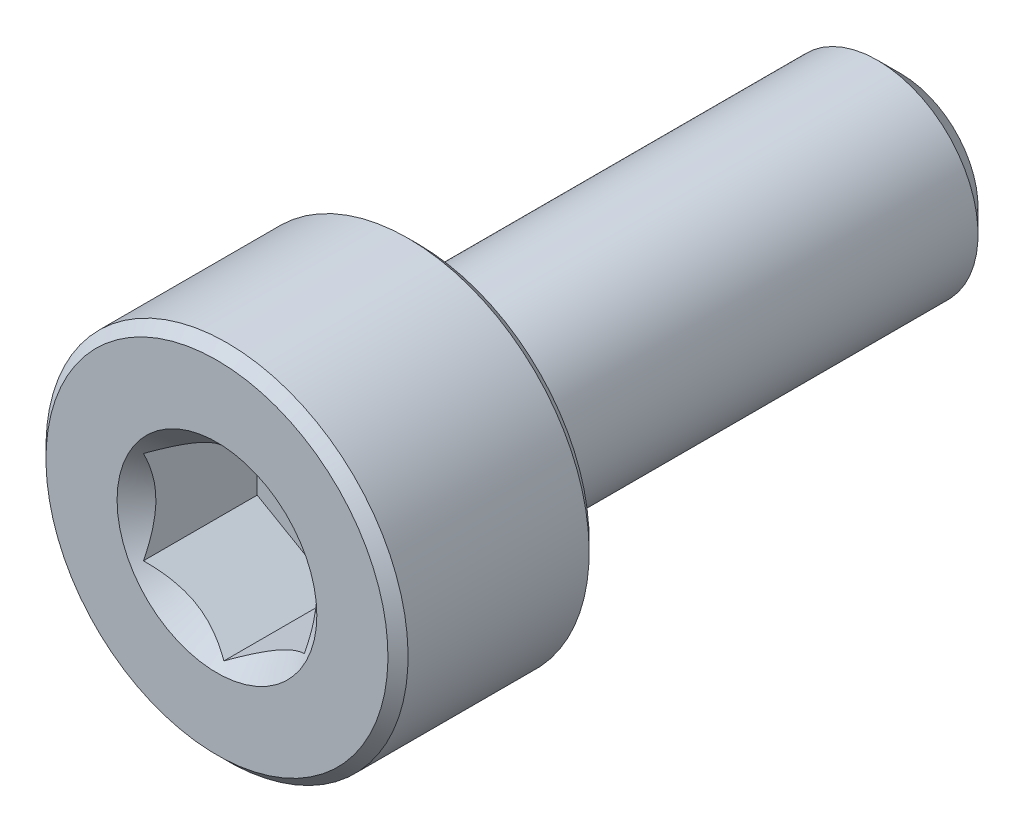
ISO-10303-21;
HEADER;
FILE_DESCRIPTION(('STEP AP214'),'2;1');
FILE_NAME('part.step','',(''),(''),'','','');
FILE_SCHEMA(('AUTOMOTIVE_DESIGN { 1 0 10303 214 1 1 1 1 }'));
ENDSEC;
DATA;
#1=APPLICATION_CONTEXT('core data for automotive mechanical design processes');
#2=APPLICATION_PROTOCOL_DEFINITION('international standard','automotive_design',2000,#1);
#3=PRODUCT_CONTEXT('',#1,'mechanical');
#4=PRODUCT('Part','Part','',(#3));
#5=PRODUCT_RELATED_PRODUCT_CATEGORY('part','',(#4));
#6=PRODUCT_DEFINITION_FORMATION('','',#4);
#7=PRODUCT_DEFINITION_CONTEXT('part definition',#1,'design');
#8=PRODUCT_DEFINITION('design','',#6,#7);
#9=PRODUCT_DEFINITION_SHAPE('','',#8);
#10=(LENGTH_UNIT() NAMED_UNIT(*) SI_UNIT(.MILLI.,.METRE.));
#11=(NAMED_UNIT(*) PLANE_ANGLE_UNIT() SI_UNIT($,.RADIAN.));
#12=(NAMED_UNIT(*) SI_UNIT($,.STERADIAN.) SOLID_ANGLE_UNIT());
#13=UNCERTAINTY_MEASURE_WITH_UNIT(LENGTH_MEASURE(1.E-05),#10,'distance_accuracy_value','');
#14=(GEOMETRIC_REPRESENTATION_CONTEXT(3) GLOBAL_UNCERTAINTY_ASSIGNED_CONTEXT((#13)) GLOBAL_UNIT_ASSIGNED_CONTEXT((#10,
#11,#12)) REPRESENTATION_CONTEXT('',''));
#15=CARTESIAN_POINT('',(0.,0.,0.));
#16=DIRECTION('',(0.,0.,1.));
#17=DIRECTION('',(1.,0.,0.));
#18=AXIS2_PLACEMENT_3D('',#15,#16,#17);
#19=CARTESIAN_POINT('',(0.,0.,1.625));
#20=DIRECTION('',(0.,0.,-1.));
#21=DIRECTION('',(0.,1.,0.));
#22=AXIS2_PLACEMENT_3D('',#19,#20,#21);
#23=TOROIDAL_SURFACE('',#22,1.375,0.125);
#24=CARTESIAN_POINT('',(0.,0.,1.75));
#25=DIRECTION('',(0.,0.,-1.));
#26=DIRECTION('',(0.,1.,0.));
#27=AXIS2_PLACEMENT_3D('',#24,#25,#26);
#28=CIRCLE('',#27,1.375);
#29=CARTESIAN_POINT('',(0.,1.375,1.75));
#30=VERTEX_POINT('',#29);
#31=EDGE_CURVE('E247',#30,#30,#28,.T.);
#32=ORIENTED_EDGE('',*,*,#31,.T.);
#33=EDGE_LOOP('',(#32));
#34=FACE_BOUND('',#33,.T.);
#35=CARTESIAN_POINT('',(0.,0.,1.625));
#36=DIRECTION('',(0.,0.,-1.));
#37=DIRECTION('',(0.,1.,0.));
#38=AXIS2_PLACEMENT_3D('',#35,#36,#37);
#39=CIRCLE('',#38,1.25);
#40=CARTESIAN_POINT('',(0.,1.25,1.625));
#41=VERTEX_POINT('',#40);
#42=EDGE_CURVE('E55',#41,#41,#39,.T.);
#43=ORIENTED_EDGE('',*,*,#42,.F.);
#44=EDGE_LOOP('',(#43));
#45=FACE_BOUND('',#44,.T.);
#46=ADVANCED_FACE('F50',(#34,#45),#23,.F.);
#47=CARTESIAN_POINT('',(0.,2.125,1.75));
#48=DIRECTION('',(0.,0.,-1.));
#49=DIRECTION('',(0.,1.,0.));
#50=AXIS2_PLACEMENT_3D('',#47,#48,#49);
#51=PLANE('',#50);
#52=CARTESIAN_POINT('',(0.,0.,1.75));
#53=DIRECTION('',(0.,0.,-1.));
#54=DIRECTION('',(0.,1.,0.));
#55=AXIS2_PLACEMENT_3D('',#52,#53,#54);
#56=CIRCLE('',#55,2.125);
#57=CARTESIAN_POINT('',(0.,2.125,1.75));
#58=VERTEX_POINT('',#57);
#59=EDGE_CURVE('E249',#58,#58,#56,.T.);
#60=ORIENTED_EDGE('',*,*,#59,.T.);
#61=EDGE_LOOP('',(#60));
#62=FACE_BOUND('',#61,.T.);
#63=ORIENTED_EDGE('',*,*,#31,.F.);
#64=EDGE_LOOP('',(#63));
#65=FACE_BOUND('',#64,.T.);
#66=ADVANCED_FACE('F117',(#62,#65),#51,.T.);
#67=CARTESIAN_POINT('',(0.,0.,1.75));
#68=DIRECTION('',(0.,0.,1.));
#69=DIRECTION('',(0.,-1.,0.));
#70=AXIS2_PLACEMENT_3D('',#67,#68,#69);
#71=CONICAL_SURFACE('',#70,2.125,0.78539816339745);
#72=CARTESIAN_POINT('',(0.,0.,1.875));
#73=DIRECTION('',(0.,0.,-1.));
#74=DIRECTION('',(0.,1.,0.));
#75=AXIS2_PLACEMENT_3D('',#72,#73,#74);
#76=CIRCLE('',#75,2.25);
#77=CARTESIAN_POINT('',(0.,2.25,1.875));
#78=VERTEX_POINT('',#77);
#79=EDGE_CURVE('E258',#78,#78,#76,.T.);
#80=ORIENTED_EDGE('',*,*,#79,.T.);
#81=EDGE_LOOP('',(#80));
#82=FACE_BOUND('',#81,.T.);
#83=ORIENTED_EDGE('',*,*,#59,.F.);
#84=EDGE_LOOP('',(#83));
#85=FACE_BOUND('',#84,.T.);
#86=ADVANCED_FACE('F122',(#82,#85),#71,.T.);
#87=CARTESIAN_POINT('',(0.,0.,-4.25));
#88=DIRECTION('',(0.,0.,-1.));
#89=DIRECTION('',(0.,1.,0.));
#90=AXIS2_PLACEMENT_3D('',#87,#88,#89);
#91=CYLINDRICAL_SURFACE('',#90,2.25);
#92=CARTESIAN_POINT('',(0.,0.,4.125));
#93=DIRECTION('',(0.,0.,-1.));
#94=DIRECTION('',(0.,1.,0.));
#95=AXIS2_PLACEMENT_3D('',#92,#93,#94);
#96=CIRCLE('',#95,2.25);
#97=CARTESIAN_POINT('',(0.,2.25,4.125));
#98=VERTEX_POINT('',#97);
#99=EDGE_CURVE('E237',#98,#98,#96,.T.);
#100=ORIENTED_EDGE('',*,*,#99,.T.);
#101=EDGE_LOOP('',(#100));
#102=FACE_BOUND('',#101,.T.);
#103=ORIENTED_EDGE('',*,*,#79,.F.);
#104=EDGE_LOOP('',(#103));
#105=FACE_BOUND('',#104,.T.);
#106=ADVANCED_FACE('F130',(#102,#105),#91,.T.);
#107=CARTESIAN_POINT('',(0.,0.,4.125));
#108=DIRECTION('',(0.,0.,-1.));
#109=DIRECTION('',(0.,1.,0.));
#110=AXIS2_PLACEMENT_3D('',#107,#108,#109);
#111=CONICAL_SURFACE('',#110,2.25,0.78539816339745);
#112=CARTESIAN_POINT('',(0.,0.,4.25));
#113=DIRECTION('',(0.,0.,-1.));
#114=DIRECTION('',(0.,1.,0.));
#115=AXIS2_PLACEMENT_3D('',#112,#113,#114);
#116=CIRCLE('',#115,2.125);
#117=CARTESIAN_POINT('',(0.,2.125,4.25));
#118=VERTEX_POINT('',#117);
#119=EDGE_CURVE('E234',#118,#118,#116,.T.);
#120=ORIENTED_EDGE('',*,*,#119,.T.);
#121=EDGE_LOOP('',(#120));
#122=FACE_BOUND('',#121,.T.);
#123=ORIENTED_EDGE('',*,*,#99,.F.);
#124=EDGE_LOOP('',(#123));
#125=FACE_BOUND('',#124,.T.);
#126=ADVANCED_FACE('F134',(#122,#125),#111,.T.);
#127=CARTESIAN_POINT('',(0.,0.,4.25));
#128=DIRECTION('',(0.,0.,1.));
#129=DIRECTION('',(0.,-1.,0.));
#130=AXIS2_PLACEMENT_3D('',#127,#128,#129);
#131=PLANE('',#130);
#132=CARTESIAN_POINT('',(0.,0.,4.25));
#133=DIRECTION('',(0.,0.,1.));
#134=DIRECTION('',(1.,0.,0.));
#135=AXIS2_PLACEMENT_3D('',#132,#133,#134);
#136=CIRCLE('',#135,1.2413030787577);
#137=CARTESIAN_POINT('',(1.2413030787577,0.,4.25));
#138=VERTEX_POINT('',#137);
#139=EDGE_CURVE('E12',#138,#138,#136,.T.);
#140=ORIENTED_EDGE('',*,*,#139,.F.);
#141=EDGE_LOOP('',(#140));
#142=FACE_BOUND('',#141,.T.);
#143=ORIENTED_EDGE('',*,*,#119,.F.);
#144=EDGE_LOOP('',(#143));
#145=FACE_BOUND('',#144,.T.);
#146=ADVANCED_FACE('F138',(#142,#145),#131,.T.);
#147=CARTESIAN_POINT('',(0.,0.,4.25));
#148=DIRECTION('',(0.,0.,1.));
#149=DIRECTION('',(1.,0.,0.));
#150=AXIS2_PLACEMENT_3D('',#147,#148,#149);
#151=CONICAL_SURFACE('',#150,1.2413030787577,0.78539816339745);
#152=ORIENTED_EDGE('',*,*,#139,.T.);
#153=EDGE_LOOP('',(#152));
#154=FACE_BOUND('',#153,.T.);
#155=CARTESIAN_POINT('',(-0.000199999999999783,-1.15481600843309,4.16351294699417));
#156=CARTESIAN_POINT('',(0.0341825950071805,-1.13496520795026,4.14367539044729));
#157=CARTESIAN_POINT('',(0.0691401181398245,-1.11478247255942,4.12500248026044));
#158=CARTESIAN_POINT('',(0.140422802956089,-1.07362739529219,4.09081220234471));
#159=CARTESIAN_POINT('',(0.176754750528984,-1.0526511355808,4.07531386864501));
#160=CARTESIAN_POINT('',(0.250016613803311,-1.01035337909803,4.04876476676382));
#161=CARTESIAN_POINT('',(0.286927851445414,-0.989042666109241,4.03764723361848));
#162=CARTESIAN_POINT('',(0.361562729310859,-0.945952199282692,4.02051732539774));
#163=CARTESIAN_POINT('',(0.399284088108635,-0.924173762626597,4.01449215708823));
#164=CARTESIAN_POINT('',(0.464292198417933,-0.886641312640015,4.00905801458905));
#165=CARTESIAN_POINT('',(0.491494371528172,-0.870936130672276,4.00825439793829));
#166=CARTESIAN_POINT('',(0.545846040669111,-0.839556179862849,4.00960415903844));
#167=CARTESIAN_POINT('',(0.572995523754875,-0.823881418494924,4.01175818916875));
#168=CARTESIAN_POINT('',(0.65405627732696,-0.777080970599367,4.02251443175003));
#169=CARTESIAN_POINT('',(0.707564140978427,-0.74618819111643,4.03541201603691));
#170=CARTESIAN_POINT('',(0.801476065143431,-0.69196811641965,4.06653819022373));
#171=CARTESIAN_POINT('',(0.842320523671834,-0.668386557293372,4.08313525732339));
#172=CARTESIAN_POINT('',(0.922409637381943,-0.622147085933681,4.12052238430685));
#173=CARTESIAN_POINT('',(0.961659010870438,-0.599486449584575,4.14129880143896));
#174=CARTESIAN_POINT('',(1.0002,-0.577234799135788,4.16351294699417));
#175=B_SPLINE_CURVE_WITH_KNOTS('',3,(#155,#156,#157,#158,#159,#160,#161,#162,#163,#164,#165,
#166,#167,#168,#169,#170,#171,#172,#173,#174),.UNSPECIFIED.,.F.,.F.,(4,2,2,2,2,2,2,2,2,4),(0.,
0.133237676828559,0.26725222983449,0.3991370762693,0.530689603280768,0.624814864263846,
0.718960890149133,0.907306626112097,1.05710100361789,1.20641411519286),.UNSPECIFIED.);
#176=CARTESIAN_POINT('',(0.,-1.15470053837925,4.16339745962156));
#177=VERTEX_POINT('',#176);
#178=CARTESIAN_POINT('',(1.,-0.577350269189626,4.16339745962155));
#179=VERTEX_POINT('',#178);
#180=EDGE_CURVE('E67',#177,#179,#175,.T.);
#181=ORIENTED_EDGE('',*,*,#180,.F.);
#182=CARTESIAN_POINT('',(-1.0002,-0.577234799135788,4.16351294699417));
#183=CARTESIAN_POINT('',(-0.965817404992819,-0.597085599618622,4.14367539044729));
#184=CARTESIAN_POINT('',(-0.930859881860175,-0.617268335009456,4.12500248026044));
#185=CARTESIAN_POINT('',(-0.85957719704391,-0.658423412276686,4.09081220234471));
#186=CARTESIAN_POINT('',(-0.823245249471016,-0.67939967198808,4.07531386864501));
#187=CARTESIAN_POINT('',(-0.749983386196689,-0.721697428470846,4.04876476676382));
#188=CARTESIAN_POINT('',(-0.713072148554585,-0.743008141459637,4.03764723361848));
#189=CARTESIAN_POINT('',(-0.638437270689141,-0.786098608286186,4.02051732539774));
#190=CARTESIAN_POINT('',(-0.600715911891364,-0.807877044942281,4.01449215708823));
#191=CARTESIAN_POINT('',(-0.535707801582066,-0.845409494928863,4.00905801458905));
#192=CARTESIAN_POINT('',(-0.508505628471827,-0.861114676896602,4.00825439793829));
#193=CARTESIAN_POINT('',(-0.454153959330887,-0.892494627706029,4.00960415903844));
#194=CARTESIAN_POINT('',(-0.427004476245124,-0.908169389073954,4.01175818916875));
#195=CARTESIAN_POINT('',(-0.345943722673039,-0.954969836969511,4.02251443175003));
#196=CARTESIAN_POINT('',(-0.292435859021572,-0.985862616452447,4.03541201603691));
#197=CARTESIAN_POINT('',(-0.198523934856568,-1.04008269114923,4.06653819022373));
#198=CARTESIAN_POINT('',(-0.157679476328165,-1.06366425027551,4.08313525732339));
#199=CARTESIAN_POINT('',(-0.0775903626180557,-1.1099037216352,4.12052238430685));
#200=CARTESIAN_POINT('',(-0.0383409891295617,-1.1325643579843,4.14129880143896));
#201=CARTESIAN_POINT('',(0.000200000000000583,-1.15481600843309,4.16351294699417));
#202=B_SPLINE_CURVE_WITH_KNOTS('',3,(#182,#183,#184,#185,#186,#187,#188,#189,#190,#191,#192,
#193,#194,#195,#196,#197,#198,#199,#200,#201),.UNSPECIFIED.,.F.,.F.,(4,2,2,2,2,2,2,2,2,4),(0.,
0.133237676828559,0.267252229834491,0.3991370762693,0.530689603280769,0.624814864263847,
0.718960890149134,0.907306626112098,1.05710100361789,1.20641411519286),.UNSPECIFIED.);
#203=CARTESIAN_POINT('',(-1.,-0.577350269189626,4.16339745962156));
#204=VERTEX_POINT('',#203);
#205=EDGE_CURVE('E60',#204,#177,#202,.T.);
#206=ORIENTED_EDGE('',*,*,#205,.F.);
#207=CARTESIAN_POINT('',(-1.,-1.21199087789934,4.57997725527287));
#208=CARTESIAN_POINT('',(-1.,-1.18273650300522,4.55741554693661));
#209=CARTESIAN_POINT('',(-1.,-1.15332592158341,4.53505703381193));
#210=CARTESIAN_POINT('',(-1.,-1.09412680336146,4.4908320719692));
#211=CARTESIAN_POINT('',(-1.,-1.06433818018076,4.46896573899681));
#212=CARTESIAN_POINT('',(-1.,-0.97387129354152,4.4039212875776));
#213=CARTESIAN_POINT('',(-1.,-0.912535008128867,4.3616436137258));
#214=CARTESIAN_POINT('',(-1.,-0.783508251342875,4.27806824785001));
#215=CARTESIAN_POINT('',(-1.,-0.715662620346606,4.23700761033256));
#216=CARTESIAN_POINT('',(-1.,-0.576509894905891,4.16150147066944));
#217=CARTESIAN_POINT('',(-1.,-0.505215555513883,4.12703362621591));
#218=CARTESIAN_POINT('',(-1.,-0.398764046939012,4.08484878246325));
#219=CARTESIAN_POINT('',(-1.,-0.365313297980423,4.07284938948254));
#220=CARTESIAN_POINT('',(-1.,-0.297551245132093,4.05153030995285));
#221=CARTESIAN_POINT('',(-1.,-0.263239887100777,4.04221079245894));
#222=CARTESIAN_POINT('',(-1.,-0.194571067470056,4.02691167587498));
#223=CARTESIAN_POINT('',(-1.,-0.160227555987668,4.02087048308474));
#224=CARTESIAN_POINT('',(-1.,-0.0910948269867766,4.01225224503756));
#225=CARTESIAN_POINT('',(-1.,-0.0563055613802756,4.009675576765));
#226=CARTESIAN_POINT('',(-1.,0.0117927152654021,4.00821295512037));
#227=CARTESIAN_POINT('',(-1.,0.0450983170825075,4.00916703835344));
#228=CARTESIAN_POINT('',(-1.,0.111441413420384,4.01434362211099));
#229=CARTESIAN_POINT('',(-1.,0.144478971732107,4.01856532046785));
#230=CARTESIAN_POINT('',(-1.,0.210624763290572,4.03010847896862));
#231=CARTESIAN_POINT('',(-1.,0.243723154740698,4.03748543479042));
#232=CARTESIAN_POINT('',(-1.,0.309187738497536,4.05492899920948));
#233=CARTESIAN_POINT('',(-1.,0.341553969590706,4.06499546496534));
#234=CARTESIAN_POINT('',(-1.,0.440875348086756,4.09974257065232));
#235=CARTESIAN_POINT('',(-1.,0.506480526276305,4.1282699754181));
#236=CARTESIAN_POINT('',(-1.,0.634628446237199,4.19175922476326));
#237=CARTESIAN_POINT('',(-1.,0.697159414671816,4.22674368431451));
#238=CARTESIAN_POINT('',(-1.,0.816694357126198,4.29898555821879));
#239=CARTESIAN_POINT('',(-1.,0.873818851530728,4.33604607035742));
#240=CARTESIAN_POINT('',(-1.,0.957979712513755,4.39336695643995));
#241=CARTESIAN_POINT('',(-1.,0.985671461150836,4.41268175945423));
#242=CARTESIAN_POINT('',(-1.,1.04067496120981,4.45182989264588));
#243=CARTESIAN_POINT('',(-1.,1.06798681474316,4.47166307919343));
#244=CARTESIAN_POINT('',(-1.,1.09514019811391,4.49171143685736));
#245=B_SPLINE_CURVE_WITH_KNOTS('',3,(#207,#208,#209,#210,#211,#212,#213,#214,#215,#216,#217,
#218,#219,#220,#221,#222,#223,#224,#225,#226,#227,#228,#229,#230,#231,#232,#233,#234,#235,#236,
#237,#238,#239,#240,#241,#242,#243,#244),.UNSPECIFIED.,.F.,.F.,(4,2,2,2,2,2,2,2,2,2,2,2,2,2,2,2,
2,2,4),(0.,0.110828944200308,0.221683685263867,0.445078388583645,0.682811068621036,
0.919723239940847,1.02624790401867,1.13277928653702,1.23723298361624,1.34169804566787,
1.44148938783186,1.54125623996228,1.64285505347063,1.74444847208079,1.95844200767913,
2.17319976124347,2.3773768581412,2.47865984803709,2.57991506662171),.UNSPECIFIED.);
#246=CARTESIAN_POINT('',(-1.,0.577350269189625,4.16339745962155));
#247=VERTEX_POINT('',#246);
#248=EDGE_CURVE('E176',#247,#204,#245,.F.);
#249=ORIENTED_EDGE('',*,*,#248,.F.);
#250=CARTESIAN_POINT('',(0.000199999999999878,1.15481600843309,4.16351294699417));
#251=CARTESIAN_POINT('',(-0.0341825950071805,1.13496520795026,4.14367539044729));
#252=CARTESIAN_POINT('',(-0.0691401181398246,1.11478247255942,4.12500248026044));
#253=CARTESIAN_POINT('',(-0.140422802956089,1.07362739529219,4.09081220234471));
#254=CARTESIAN_POINT('',(-0.176754750528984,1.0526511355808,4.07531386864501));
#255=CARTESIAN_POINT('',(-0.250016613803311,1.01035337909803,4.04876476676382));
#256=CARTESIAN_POINT('',(-0.286927851445414,0.989042666109241,4.03764723361848));
#257=CARTESIAN_POINT('',(-0.361562729310859,0.945952199282692,4.02051732539774));
#258=CARTESIAN_POINT('',(-0.399284088108635,0.924173762626597,4.01449215708823));
#259=CARTESIAN_POINT('',(-0.464292198417933,0.886641312640015,4.00905801458905));
#260=CARTESIAN_POINT('',(-0.491494371528171,0.870936130672276,4.00825439793829));
#261=CARTESIAN_POINT('',(-0.545846040669111,0.839556179862849,4.00960415903844));
#262=CARTESIAN_POINT('',(-0.572995523754875,0.823881418494924,4.01175818916875));
#263=CARTESIAN_POINT('',(-0.654056277326959,0.777080970599367,4.02251443175003));
#264=CARTESIAN_POINT('',(-0.707564140978426,0.746188191116431,4.03541201603691));
#265=CARTESIAN_POINT('',(-0.801476065143431,0.69196811641965,4.06653819022373));
#266=CARTESIAN_POINT('',(-0.842320523671834,0.668386557293372,4.08313525732339));
#267=CARTESIAN_POINT('',(-0.922409637381943,0.622147085933681,4.12052238430685));
#268=CARTESIAN_POINT('',(-0.961659010870438,0.599486449584575,4.14129880143896));
#269=CARTESIAN_POINT('',(-1.0002,0.577234799135787,4.16351294699417));
#270=B_SPLINE_CURVE_WITH_KNOTS('',3,(#250,#251,#252,#253,#254,#255,#256,#257,#258,#259,#260,
#261,#262,#263,#264,#265,#266,#267,#268,#269),.UNSPECIFIED.,.F.,.F.,(4,2,2,2,2,2,2,2,2,4),(0.,
0.133237676828559,0.26725222983449,0.3991370762693,0.530689603280768,0.624814864263845,
0.718960890149132,0.907306626112096,1.05710100361789,1.20641411519286),.UNSPECIFIED.);
#271=CARTESIAN_POINT('',(0.,1.15470053837925,4.16339745962156));
#272=VERTEX_POINT('',#271);
#273=EDGE_CURVE('E169',#272,#247,#270,.T.);
#274=ORIENTED_EDGE('',*,*,#273,.F.);
#275=CARTESIAN_POINT('',(1.0002,0.577234799135788,4.16351294699417));
#276=CARTESIAN_POINT('',(0.96581740499282,0.597085599618621,4.14367539044729));
#277=CARTESIAN_POINT('',(0.930859881860176,0.617268335009456,4.12500248026044));
#278=CARTESIAN_POINT('',(0.859577197043911,0.658423412276686,4.09081220234471));
#279=CARTESIAN_POINT('',(0.823245249471016,0.67939967198808,4.07531386864501));
#280=CARTESIAN_POINT('',(0.749983386196689,0.721697428470846,4.04876476676382));
#281=CARTESIAN_POINT('',(0.713072148554586,0.743008141459637,4.03764723361848));
#282=CARTESIAN_POINT('',(0.638437270689141,0.786098608286186,4.02051732539774));
#283=CARTESIAN_POINT('',(0.600715911891364,0.807877044942281,4.01449215708823));
#284=CARTESIAN_POINT('',(0.535707801582066,0.845409494928863,4.00905801458905));
#285=CARTESIAN_POINT('',(0.508505628471827,0.861114676896602,4.00825439793829));
#286=CARTESIAN_POINT('',(0.454153959330887,0.892494627706029,4.00960415903844));
#287=CARTESIAN_POINT('',(0.427004476245124,0.908169389073954,4.01175818916875));
#288=CARTESIAN_POINT('',(0.345943722673039,0.954969836969511,4.02251443175003));
#289=CARTESIAN_POINT('',(0.292435859021572,0.985862616452448,4.03541201603691));
#290=CARTESIAN_POINT('',(0.198523934856568,1.04008269114923,4.06653819022373));
#291=CARTESIAN_POINT('',(0.157679476328165,1.06366425027551,4.08313525732339));
#292=CARTESIAN_POINT('',(0.0775903626180558,1.1099037216352,4.12052238430685));
#293=CARTESIAN_POINT('',(0.0383409891295618,1.1325643579843,4.14129880143896));
#294=CARTESIAN_POINT('',(-0.00020000000000038,1.15481600843309,4.16351294699417));
#295=B_SPLINE_CURVE_WITH_KNOTS('',3,(#275,#276,#277,#278,#279,#280,#281,#282,#283,#284,#285,
#286,#287,#288,#289,#290,#291,#292,#293,#294),.UNSPECIFIED.,.F.,.F.,(4,2,2,2,2,2,2,2,2,4),(0.,
0.133237676828559,0.26725222983449,0.3991370762693,0.530689603280769,0.624814864263847,
0.718960890149134,0.907306626112098,1.05710100361789,1.20641411519286),.UNSPECIFIED.);
#296=CARTESIAN_POINT('',(1.,0.577350269189626,4.16339745962156));
#297=VERTEX_POINT('',#296);
#298=EDGE_CURVE('E160',#297,#272,#295,.T.);
#299=ORIENTED_EDGE('',*,*,#298,.F.);
#300=CARTESIAN_POINT('',(1.,-1.21199087789934,4.57997725527287));
#301=CARTESIAN_POINT('',(1.,-1.18273650300521,4.5574155469366));
#302=CARTESIAN_POINT('',(1.,-1.15332592158341,4.53505703381193));
#303=CARTESIAN_POINT('',(1.,-1.09412680336146,4.4908320719692));
#304=CARTESIAN_POINT('',(1.,-1.06433818018075,4.46896573899681));
#305=CARTESIAN_POINT('',(1.,-0.973871293541519,4.4039212875776));
#306=CARTESIAN_POINT('',(1.,-0.912535008128866,4.3616436137258));
#307=CARTESIAN_POINT('',(1.,-0.783508251342875,4.27806824785001));
#308=CARTESIAN_POINT('',(1.,-0.715662620346606,4.23700761033256));
#309=CARTESIAN_POINT('',(1.,-0.576509894905891,4.16150147066944));
#310=CARTESIAN_POINT('',(1.,-0.505215555513883,4.12703362621591));
#311=CARTESIAN_POINT('',(1.,-0.398764046939012,4.08484878246325));
#312=CARTESIAN_POINT('',(1.,-0.365313297980422,4.07284938948254));
#313=CARTESIAN_POINT('',(1.,-0.297551245132093,4.05153030995285));
#314=CARTESIAN_POINT('',(1.,-0.263239887100777,4.04221079245894));
#315=CARTESIAN_POINT('',(1.,-0.194571067470056,4.02691167587498));
#316=CARTESIAN_POINT('',(1.,-0.160227555987667,4.02087048308474));
#317=CARTESIAN_POINT('',(1.,-0.0910948269867763,4.01225224503756));
#318=CARTESIAN_POINT('',(1.,-0.0563055613802753,4.009675576765));
#319=CARTESIAN_POINT('',(1.,0.0117927152654025,4.00821295512037));
#320=CARTESIAN_POINT('',(1.,0.045098317082508,4.00916703835344));
#321=CARTESIAN_POINT('',(1.,0.111441413420384,4.01434362211099));
#322=CARTESIAN_POINT('',(1.,0.144478971732107,4.01856532046785));
#323=CARTESIAN_POINT('',(1.,0.210624763290573,4.03010847896862));
#324=CARTESIAN_POINT('',(1.,0.243723154740699,4.03748543479042));
#325=CARTESIAN_POINT('',(1.,0.309187738497536,4.05492899920948));
#326=CARTESIAN_POINT('',(1.,0.341553969590707,4.06499546496534));
#327=CARTESIAN_POINT('',(1.,0.440875348086756,4.09974257065232));
#328=CARTESIAN_POINT('',(1.,0.506480526276306,4.1282699754181));
#329=CARTESIAN_POINT('',(1.,0.634628446237199,4.19175922476326));
#330=CARTESIAN_POINT('',(1.,0.697159414671816,4.22674368431451));
#331=CARTESIAN_POINT('',(1.,0.816694357126198,4.29898555821879));
#332=CARTESIAN_POINT('',(1.,0.873818851530728,4.33604607035742));
#333=CARTESIAN_POINT('',(1.,0.957979712513755,4.39336695643995));
#334=CARTESIAN_POINT('',(1.,0.985671461150836,4.41268175945423));
#335=CARTESIAN_POINT('',(1.,1.04067496120981,4.45182989264588));
#336=CARTESIAN_POINT('',(1.,1.06798681474316,4.47166307919343));
#337=CARTESIAN_POINT('',(1.,1.09514019811391,4.49171143685736));
#338=B_SPLINE_CURVE_WITH_KNOTS('',3,(#300,#301,#302,#303,#304,#305,#306,#307,#308,#309,#310,
#311,#312,#313,#314,#315,#316,#317,#318,#319,#320,#321,#322,#323,#324,#325,#326,#327,#328,#329,
#330,#331,#332,#333,#334,#335,#336,#337),.UNSPECIFIED.,.F.,.F.,(4,2,2,2,2,2,2,2,2,2,2,2,2,2,2,2,
2,2,4),(0.,0.110828944200308,0.221683685263867,0.445078388583644,0.682811068621036,
0.919723239940846,1.02624790401867,1.13277928653702,1.23723298361624,1.34169804566787,
1.44148938783186,1.54125623996228,1.64285505347063,1.74444847208079,1.95844200767913,
2.17319976124347,2.3773768581412,2.47865984803709,2.57991506662171),.UNSPECIFIED.);
#339=EDGE_CURVE('E152',#179,#297,#338,.T.);
#340=ORIENTED_EDGE('',*,*,#339,.F.);
#341=EDGE_LOOP('',(#181,#206,#249,#274,#299,#340));
#342=FACE_BOUND('',#341,.T.);
#343=ADVANCED_FACE('F52',(#154,#342),#151,.F.);
#344=CARTESIAN_POINT('',(0.,2.125,2.75));
#345=DIRECTION('',(0.,0.,-1.));
#346=DIRECTION('',(0.,1.,0.));
#347=AXIS2_PLACEMENT_3D('',#344,#345,#346);
#348=PLANE('',#347);
#349=DIRECTION('',(0.866025403784438,0.5,0.));
#350=VECTOR('',#349,1.);
#351=CARTESIAN_POINT('',(0.,-1.15470053837925,2.75));
#352=LINE('',#351,#350);
#353=CARTESIAN_POINT('',(0.,-1.15470053837925,2.75));
#354=VERTEX_POINT('',#353);
#355=CARTESIAN_POINT('',(1.,-0.577350269189626,2.75));
#356=VERTEX_POINT('',#355);
#357=EDGE_CURVE('E221',#354,#356,#352,.T.);
#358=ORIENTED_EDGE('',*,*,#357,.T.);
#359=DIRECTION('',(0.,1.,0.));
#360=VECTOR('',#359,1.);
#361=CARTESIAN_POINT('',(1.,-0.577350269189626,2.75));
#362=LINE('',#361,#360);
#363=CARTESIAN_POINT('',(1.,0.577350269189626,2.75));
#364=VERTEX_POINT('',#363);
#365=EDGE_CURVE('E161',#356,#364,#362,.T.);
#366=ORIENTED_EDGE('',*,*,#365,.T.);
#367=DIRECTION('',(-0.866025403784439,0.5,0.));
#368=VECTOR('',#367,1.);
#369=CARTESIAN_POINT('',(1.,0.577350269189626,2.75));
#370=LINE('',#369,#368);
#371=CARTESIAN_POINT('',(0.,1.15470053837925,2.75));
#372=VERTEX_POINT('',#371);
#373=EDGE_CURVE('E222',#364,#372,#370,.T.);
#374=ORIENTED_EDGE('',*,*,#373,.T.);
#375=DIRECTION('',(-0.866025403784438,-0.5,0.));
#376=VECTOR('',#375,1.);
#377=CARTESIAN_POINT('',(0.,1.15470053837925,2.75));
#378=LINE('',#377,#376);
#379=CARTESIAN_POINT('',(-1.,0.577350269189626,2.75));
#380=VERTEX_POINT('',#379);
#381=EDGE_CURVE('E227',#372,#380,#378,.T.);
#382=ORIENTED_EDGE('',*,*,#381,.T.);
#383=DIRECTION('',(0.,-1.,0.));
#384=VECTOR('',#383,1.);
#385=CARTESIAN_POINT('',(-1.,0.577350269189626,2.75));
#386=LINE('',#385,#384);
#387=CARTESIAN_POINT('',(-1.,-0.577350269189626,2.75));
#388=VERTEX_POINT('',#387);
#389=EDGE_CURVE('E212',#380,#388,#386,.T.);
#390=ORIENTED_EDGE('',*,*,#389,.T.);
#391=DIRECTION('',(0.866025403784439,-0.5,0.));
#392=VECTOR('',#391,1.);
#393=CARTESIAN_POINT('',(-1.,-0.577350269189626,2.75));
#394=LINE('',#393,#392);
#395=EDGE_CURVE('E211',#388,#354,#394,.T.);
#396=ORIENTED_EDGE('',*,*,#395,.T.);
#397=EDGE_LOOP('',(#358,#366,#374,#382,#390,#396));
#398=FACE_BOUND('',#397,.T.);
#399=ADVANCED_FACE('F143',(#398),#348,.F.);
#400=CARTESIAN_POINT('',(0.,-1.15470053837925,-1.30505046330389));
#401=DIRECTION('',(0.5,-0.866025403784438,0.));
#402=DIRECTION('',(0.866025403784438,0.5,0.));
#403=AXIS2_PLACEMENT_3D('',#400,#401,#402);
#404=PLANE('',#403);
#405=DIRECTION('',(0.,0.,1.));
#406=VECTOR('',#405,1.);
#407=CARTESIAN_POINT('',(0.,-1.15470053837925,-1.30505046330389));
#408=LINE('',#407,#406);
#409=EDGE_CURVE('E215',#354,#177,#408,.T.);
#410=ORIENTED_EDGE('',*,*,#409,.T.);
#411=ORIENTED_EDGE('',*,*,#180,.T.);
#412=DIRECTION('',(0.,0.,1.));
#413=VECTOR('',#412,1.);
#414=CARTESIAN_POINT('',(1.,-0.577350269189626,-1.30505046330389));
#415=LINE('',#414,#413);
#416=EDGE_CURVE('E230',#356,#179,#415,.T.);
#417=ORIENTED_EDGE('',*,*,#416,.F.);
#418=ORIENTED_EDGE('',*,*,#357,.F.);
#419=EDGE_LOOP('',(#410,#411,#417,#418));
#420=FACE_BOUND('',#419,.T.);
#421=ADVANCED_FACE('F145',(#420),#404,.F.);
#422=CARTESIAN_POINT('',(-1.,-0.577350269189626,-1.30505046330389));
#423=DIRECTION('',(-0.5,-0.866025403784439,0.));
#424=DIRECTION('',(0.866025403784439,-0.5,0.));
#425=AXIS2_PLACEMENT_3D('',#422,#423,#424);
#426=PLANE('',#425);
#427=DIRECTION('',(0.,0.,1.));
#428=VECTOR('',#427,1.);
#429=CARTESIAN_POINT('',(-1.,-0.577350269189626,-1.30505046330389));
#430=LINE('',#429,#428);
#431=EDGE_CURVE('E206',#388,#204,#430,.T.);
#432=ORIENTED_EDGE('',*,*,#431,.T.);
#433=ORIENTED_EDGE('',*,*,#205,.T.);
#434=ORIENTED_EDGE('',*,*,#409,.F.);
#435=ORIENTED_EDGE('',*,*,#395,.F.);
#436=EDGE_LOOP('',(#432,#433,#434,#435));
#437=FACE_BOUND('',#436,.T.);
#438=ADVANCED_FACE('F191',(#437),#426,.F.);
#439=CARTESIAN_POINT('',(-1.,0.577350269189626,-1.30505046330389));
#440=DIRECTION('',(-1.,0.,0.));
#441=DIRECTION('',(0.,0.,1.));
#442=AXIS2_PLACEMENT_3D('',#439,#440,#441);
#443=PLANE('',#442);
#444=DIRECTION('',(0.,0.,1.));
#445=VECTOR('',#444,1.);
#446=CARTESIAN_POINT('',(-1.,0.577350269189626,-1.30505046330389));
#447=LINE('',#446,#445);
#448=EDGE_CURVE('E209',#380,#247,#447,.T.);
#449=ORIENTED_EDGE('',*,*,#448,.T.);
#450=ORIENTED_EDGE('',*,*,#248,.T.);
#451=ORIENTED_EDGE('',*,*,#431,.F.);
#452=ORIENTED_EDGE('',*,*,#389,.F.);
#453=EDGE_LOOP('',(#449,#450,#451,#452));
#454=FACE_BOUND('',#453,.T.);
#455=ADVANCED_FACE('F186',(#454),#443,.F.);
#456=CARTESIAN_POINT('',(0.,1.15470053837925,-1.30505046330389));
#457=DIRECTION('',(-0.5,0.866025403784438,0.));
#458=DIRECTION('',(-0.866025403784438,-0.5,0.));
#459=AXIS2_PLACEMENT_3D('',#456,#457,#458);
#460=PLANE('',#459);
#461=DIRECTION('',(0.,0.,1.));
#462=VECTOR('',#461,1.);
#463=CARTESIAN_POINT('',(0.,1.15470053837925,-1.30505046330389));
#464=LINE('',#463,#462);
#465=EDGE_CURVE('E226',#372,#272,#464,.T.);
#466=ORIENTED_EDGE('',*,*,#465,.T.);
#467=ORIENTED_EDGE('',*,*,#273,.T.);
#468=ORIENTED_EDGE('',*,*,#448,.F.);
#469=ORIENTED_EDGE('',*,*,#381,.F.);
#470=EDGE_LOOP('',(#466,#467,#468,#469));
#471=FACE_BOUND('',#470,.T.);
#472=ADVANCED_FACE('F183',(#471),#460,.F.);
#473=CARTESIAN_POINT('',(1.,0.577350269189626,-1.30505046330389));
#474=DIRECTION('',(0.5,0.866025403784439,0.));
#475=DIRECTION('',(-0.866025403784439,0.5,0.));
#476=AXIS2_PLACEMENT_3D('',#473,#474,#475);
#477=PLANE('',#476);
#478=DIRECTION('',(0.,0.,1.));
#479=VECTOR('',#478,1.);
#480=CARTESIAN_POINT('',(1.,0.577350269189626,-1.30505046330389));
#481=LINE('',#480,#479);
#482=EDGE_CURVE('E225',#364,#297,#481,.T.);
#483=ORIENTED_EDGE('',*,*,#482,.T.);
#484=ORIENTED_EDGE('',*,*,#298,.T.);
#485=ORIENTED_EDGE('',*,*,#465,.F.);
#486=ORIENTED_EDGE('',*,*,#373,.F.);
#487=EDGE_LOOP('',(#483,#484,#485,#486));
#488=FACE_BOUND('',#487,.T.);
#489=ADVANCED_FACE('F111',(#488),#477,.F.);
#490=CARTESIAN_POINT('',(1.,-0.577350269189626,-1.30505046330389));
#491=DIRECTION('',(1.,0.,0.));
#492=DIRECTION('',(0.,0.,-1.));
#493=AXIS2_PLACEMENT_3D('',#490,#491,#492);
#494=PLANE('',#493);
#495=ORIENTED_EDGE('',*,*,#416,.T.);
#496=ORIENTED_EDGE('',*,*,#339,.T.);
#497=ORIENTED_EDGE('',*,*,#482,.F.);
#498=ORIENTED_EDGE('',*,*,#365,.F.);
#499=EDGE_LOOP('',(#495,#496,#497,#498));
#500=FACE_BOUND('',#499,.T.);
#501=ADVANCED_FACE('F105',(#500),#494,.F.);
#502=CARTESIAN_POINT('',(0.,0.,0.903312163512958));
#503=DIRECTION('',(0.,0.,1.));
#504=DIRECTION('',(0.,-1.,0.));
#505=AXIS2_PLACEMENT_3D('',#502,#503,#504);
#506=CONICAL_SURFACE('',#505,0.,1.04719755119659);
#507=ORIENTED_EDGE('',*,*,#42,.T.);
#508=EDGE_LOOP('',(#507));
#509=FACE_BOUND('',#508,.T.);
#510=CARTESIAN_POINT('',(0.,0.,0.903312163512958));
#511=VERTEX_POINT('',#510);
#512=VERTEX_LOOP('',#511);
#513=FACE_BOUND('',#512,.T.);
#514=ADVANCED_FACE('F103',(#509,#513),#506,.T.);
#515=CLOSED_SHELL('',(#46,#66,#86,#106,#126,#146,#343,#399,#421,#438,#455,#472,#489,#501,#514));
#516=MANIFOLD_SOLID_BREP('B2',#515);
#517=CARTESIAN_POINT('',(-2.26,-2.25,1.625));
#518=DIRECTION('',(0.,0.,-1.));
#519=DIRECTION('',(-1.,0.,0.));
#520=AXIS2_PLACEMENT_3D('',#517,#518,#519);
#521=PLANE('',#520);
#522=CARTESIAN_POINT('',(0.,0.,1.625));
#523=DIRECTION('',(0.,0.,-1.));
#524=DIRECTION('',(0.,1.,0.));
#525=AXIS2_PLACEMENT_3D('',#522,#523,#524);
#526=CIRCLE('',#525,1.25);
#527=CARTESIAN_POINT('',(0.,1.25,1.625));
#528=VERTEX_POINT('',#527);
#529=EDGE_CURVE('E386',#528,#528,#526,.T.);
#530=ORIENTED_EDGE('',*,*,#529,.F.);
#531=EDGE_LOOP('',(#530));
#532=FACE_BOUND('',#531,.T.);
#533=ADVANCED_FACE('F376',(#532),#521,.F.);
#534=CARTESIAN_POINT('',(0.,0.957716426222752,-4.25));
#535=DIRECTION('',(0.,0.,-1.));
#536=DIRECTION('',(0.,1.,0.));
#537=AXIS2_PLACEMENT_3D('',#534,#535,#536);
#538=PLANE('',#537);
#539=CARTESIAN_POINT('',(0.,0.,-4.25));
#540=DIRECTION('',(0.,0.,-1.));
#541=DIRECTION('',(0.,1.,0.));
#542=AXIS2_PLACEMENT_3D('',#539,#540,#541);
#543=CIRCLE('',#542,0.957716426222752);
#544=CARTESIAN_POINT('',(0.,0.957716426222752,-4.25));
#545=VERTEX_POINT('',#544);
#546=EDGE_CURVE('E49',#545,#545,#543,.T.);
#547=ORIENTED_EDGE('',*,*,#546,.T.);
#548=EDGE_LOOP('',(#547));
#549=FACE_BOUND('',#548,.T.);
#550=ADVANCED_FACE('F397',(#549),#538,.T.);
#551=CARTESIAN_POINT('',(0.,0.,-4.25));
#552=DIRECTION('',(0.,0.,1.));
#553=DIRECTION('',(0.,-1.,0.));
#554=AXIS2_PLACEMENT_3D('',#551,#552,#553);
#555=CONICAL_SURFACE('',#554,0.957716426222752,0.785398163397446);
#556=CARTESIAN_POINT('',(0.,0.,-3.95771642622275));
#557=DIRECTION('',(0.,0.,-1.));
#558=DIRECTION('',(0.,1.,0.));
#559=AXIS2_PLACEMENT_3D('',#556,#557,#558);
#560=CIRCLE('',#559,1.25);
#561=CARTESIAN_POINT('',(0.,1.25,-3.95771642622275));
#562=VERTEX_POINT('',#561);
#563=EDGE_CURVE('E382',#562,#562,#560,.T.);
#564=ORIENTED_EDGE('',*,*,#563,.T.);
#565=EDGE_LOOP('',(#564));
#566=FACE_BOUND('',#565,.T.);
#567=ORIENTED_EDGE('',*,*,#546,.F.);
#568=EDGE_LOOP('',(#567));
#569=FACE_BOUND('',#568,.T.);
#570=ADVANCED_FACE('F401',(#566,#569),#555,.T.);
#571=CARTESIAN_POINT('',(0.,0.,-4.25));
#572=DIRECTION('',(0.,0.,-1.));
#573=DIRECTION('',(0.,1.,0.));
#574=AXIS2_PLACEMENT_3D('',#571,#572,#573);
#575=CYLINDRICAL_SURFACE('',#574,1.25);
#576=ORIENTED_EDGE('',*,*,#529,.T.);
#577=EDGE_LOOP('',(#576));
#578=FACE_BOUND('',#577,.T.);
#579=ORIENTED_EDGE('',*,*,#563,.F.);
#580=EDGE_LOOP('',(#579));
#581=FACE_BOUND('',#580,.T.);
#582=ADVANCED_FACE('F393',(#578,#581),#575,.T.);
#583=CLOSED_SHELL('',(#533,#550,#570,#582));
#584=MANIFOLD_SOLID_BREP('B6',#583);
#585=ADVANCED_BREP_SHAPE_REPRESENTATION('',(#18,#516,#584),#14);
#586=SHAPE_DEFINITION_REPRESENTATION(#9,#585);
ENDSEC;
END-ISO-10303-21;
